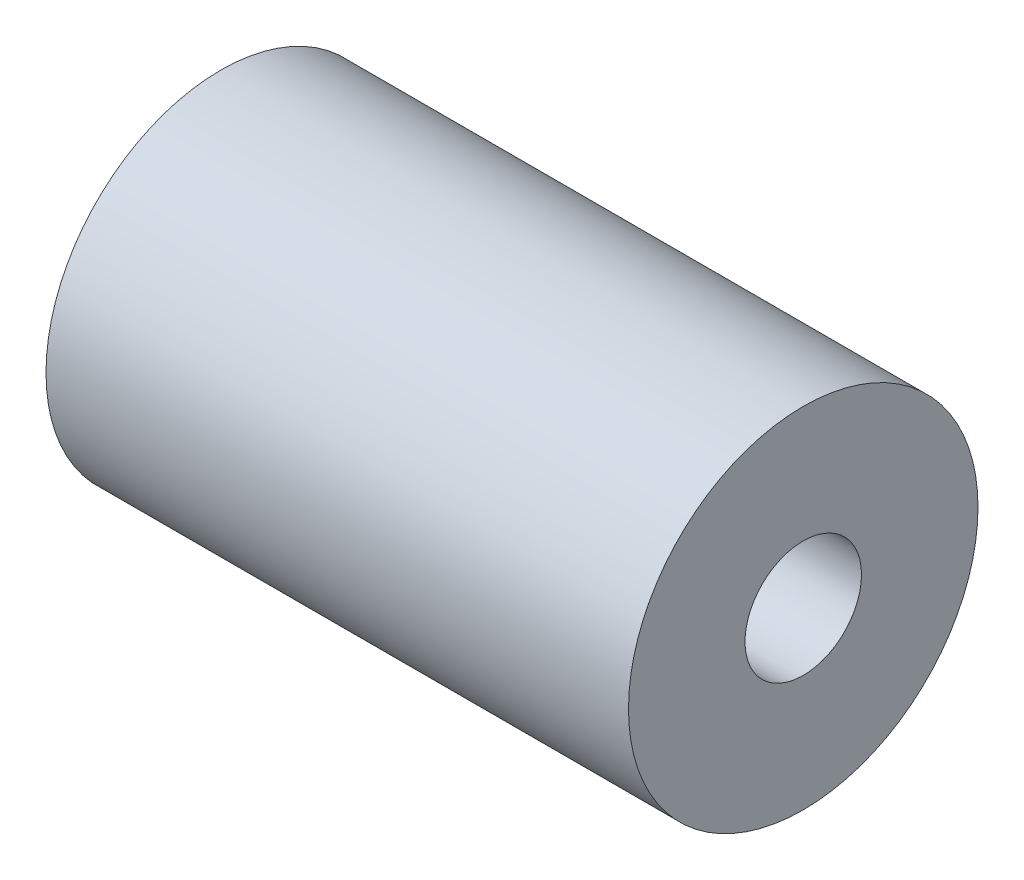
ISO-10303-21;
HEADER;
FILE_DESCRIPTION(('STEP AP214'),'2;1');
FILE_NAME('part.step','',(''),(''),'','','');
FILE_SCHEMA(('AUTOMOTIVE_DESIGN { 1 0 10303 214 1 1 1 1 }'));
ENDSEC;
DATA;
#1=APPLICATION_CONTEXT('core data for automotive mechanical design processes');
#2=APPLICATION_PROTOCOL_DEFINITION('international standard','automotive_design',2000,#1);
#3=PRODUCT_CONTEXT('',#1,'mechanical');
#4=PRODUCT('Part','Part','',(#3));
#5=PRODUCT_RELATED_PRODUCT_CATEGORY('part','',(#4));
#6=PRODUCT_DEFINITION_FORMATION('','',#4);
#7=PRODUCT_DEFINITION_CONTEXT('part definition',#1,'design');
#8=PRODUCT_DEFINITION('design','',#6,#7);
#9=PRODUCT_DEFINITION_SHAPE('','',#8);
#10=(LENGTH_UNIT() NAMED_UNIT(*) SI_UNIT(.MILLI.,.METRE.));
#11=(NAMED_UNIT(*) PLANE_ANGLE_UNIT() SI_UNIT($,.RADIAN.));
#12=(NAMED_UNIT(*) SI_UNIT($,.STERADIAN.) SOLID_ANGLE_UNIT());
#13=UNCERTAINTY_MEASURE_WITH_UNIT(LENGTH_MEASURE(1.E-05),#10,'distance_accuracy_value','');
#14=(GEOMETRIC_REPRESENTATION_CONTEXT(3) GLOBAL_UNCERTAINTY_ASSIGNED_CONTEXT((#13)) GLOBAL_UNIT_ASSIGNED_CONTEXT((#10,
#11,#12)) REPRESENTATION_CONTEXT('',''));
#15=CARTESIAN_POINT('',(0.,0.,0.));
#16=DIRECTION('',(0.,0.,1.));
#17=DIRECTION('',(1.,0.,0.));
#18=AXIS2_PLACEMENT_3D('',#15,#16,#17);
#19=CARTESIAN_POINT('',(10.,0.,0.));
#20=DIRECTION('',(1.,0.,0.));
#21=DIRECTION('',(0.,0.,-1.));
#22=AXIS2_PLACEMENT_3D('',#19,#20,#21);
#23=PLANE('',#22);
#24=CARTESIAN_POINT('',(10.,0.,0.));
#25=DIRECTION('',(1.,0.,0.));
#26=DIRECTION('',(0.,0.,-1.));
#27=AXIS2_PLACEMENT_3D('',#24,#25,#26);
#28=CIRCLE('',#27,3.);
#29=CARTESIAN_POINT('',(10.,0.,-3.));
#30=VERTEX_POINT('',#29);
#31=EDGE_CURVE('E11',#30,#30,#28,.T.);
#32=ORIENTED_EDGE('',*,*,#31,.T.);
#33=EDGE_LOOP('',(#32));
#34=FACE_BOUND('',#33,.T.);
#35=CARTESIAN_POINT('',(10.,0.,0.));
#36=DIRECTION('',(1.,0.,0.));
#37=DIRECTION('',(0.,0.,-1.));
#38=AXIS2_PLACEMENT_3D('',#35,#36,#37);
#39=CIRCLE('',#38,1.);
#40=CARTESIAN_POINT('',(10.,0.,-1.));
#41=VERTEX_POINT('',#40);
#42=EDGE_CURVE('E52',#41,#41,#39,.T.);
#43=ORIENTED_EDGE('',*,*,#42,.F.);
#44=EDGE_LOOP('',(#43));
#45=FACE_BOUND('',#44,.T.);
#46=ADVANCED_FACE('F41',(#34,#45),#23,.T.);
#47=CARTESIAN_POINT('',(0.,0.,0.));
#48=DIRECTION('',(1.,0.,0.));
#49=DIRECTION('',(0.,0.,-1.));
#50=AXIS2_PLACEMENT_3D('',#47,#48,#49);
#51=PLANE('',#50);
#52=CARTESIAN_POINT('',(0.,0.,0.));
#53=DIRECTION('',(1.,0.,0.));
#54=DIRECTION('',(0.,0.,-1.));
#55=AXIS2_PLACEMENT_3D('',#52,#53,#54);
#56=CIRCLE('',#55,3.);
#57=CARTESIAN_POINT('',(0.,0.,-3.));
#58=VERTEX_POINT('',#57);
#59=EDGE_CURVE('E45',#58,#58,#56,.T.);
#60=ORIENTED_EDGE('',*,*,#59,.F.);
#61=EDGE_LOOP('',(#60));
#62=FACE_BOUND('',#61,.T.);
#63=CARTESIAN_POINT('',(0.,0.,0.));
#64=DIRECTION('',(1.,0.,0.));
#65=DIRECTION('',(0.,0.,-1.));
#66=AXIS2_PLACEMENT_3D('',#63,#64,#65);
#67=CIRCLE('',#66,1.);
#68=CARTESIAN_POINT('',(0.,0.,-1.));
#69=VERTEX_POINT('',#68);
#70=EDGE_CURVE('E54',#69,#69,#67,.T.);
#71=ORIENTED_EDGE('',*,*,#70,.T.);
#72=EDGE_LOOP('',(#71));
#73=FACE_BOUND('',#72,.T.);
#74=ADVANCED_FACE('F64',(#62,#73),#51,.F.);
#75=CARTESIAN_POINT('',(10.,0.,0.));
#76=DIRECTION('',(-1.,0.,0.));
#77=DIRECTION('',(0.,0.,1.));
#78=AXIS2_PLACEMENT_3D('',#75,#76,#77);
#79=CYLINDRICAL_SURFACE('',#78,3.);
#80=ORIENTED_EDGE('',*,*,#31,.F.);
#81=EDGE_LOOP('',(#80));
#82=FACE_BOUND('',#81,.T.);
#83=ORIENTED_EDGE('',*,*,#59,.T.);
#84=EDGE_LOOP('',(#83));
#85=FACE_BOUND('',#84,.T.);
#86=ADVANCED_FACE('F43',(#82,#85),#79,.T.);
#87=CARTESIAN_POINT('',(10.,0.,0.));
#88=DIRECTION('',(-1.,0.,0.));
#89=DIRECTION('',(0.,0.,1.));
#90=AXIS2_PLACEMENT_3D('',#87,#88,#89);
#91=CYLINDRICAL_SURFACE('',#90,1.);
#92=ORIENTED_EDGE('',*,*,#42,.T.);
#93=EDGE_LOOP('',(#92));
#94=FACE_BOUND('',#93,.T.);
#95=ORIENTED_EDGE('',*,*,#70,.F.);
#96=EDGE_LOOP('',(#95));
#97=FACE_BOUND('',#96,.T.);
#98=ADVANCED_FACE('F60',(#94,#97),#91,.F.);
#99=CLOSED_SHELL('',(#46,#74,#86,#98));
#100=MANIFOLD_SOLID_BREP('B2',#99);
#101=ADVANCED_BREP_SHAPE_REPRESENTATION('',(#18,#100),#14);
#102=SHAPE_DEFINITION_REPRESENTATION(#9,#101);
ENDSEC;
END-ISO-10303-21;
